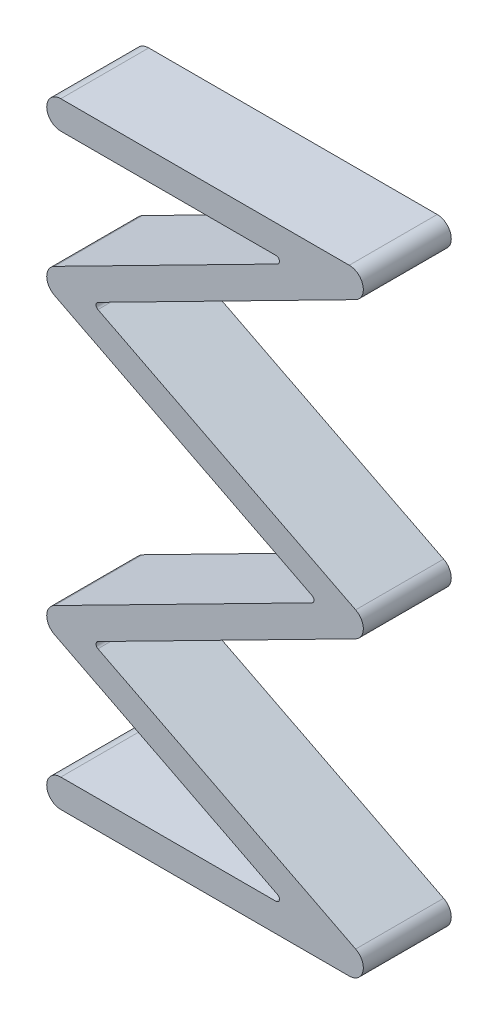
ISO-10303-21;
HEADER;
FILE_DESCRIPTION(('STEP AP214'),'2;1');
FILE_NAME('part.step','',(''),(''),'','','');
FILE_SCHEMA(('AUTOMOTIVE_DESIGN { 1 0 10303 214 1 1 1 1 }'));
ENDSEC;
DATA;
#1=APPLICATION_CONTEXT('core data for automotive mechanical design processes');
#2=APPLICATION_PROTOCOL_DEFINITION('international standard','automotive_design',2000,#1);
#3=PRODUCT_CONTEXT('',#1,'mechanical');
#4=PRODUCT('Part','Part','',(#3));
#5=PRODUCT_RELATED_PRODUCT_CATEGORY('part','',(#4));
#6=PRODUCT_DEFINITION_FORMATION('','',#4);
#7=PRODUCT_DEFINITION_CONTEXT('part definition',#1,'design');
#8=PRODUCT_DEFINITION('design','',#6,#7);
#9=PRODUCT_DEFINITION_SHAPE('','',#8);
#10=(LENGTH_UNIT() NAMED_UNIT(*) SI_UNIT(.MILLI.,.METRE.));
#11=(NAMED_UNIT(*) PLANE_ANGLE_UNIT() SI_UNIT($,.RADIAN.));
#12=(NAMED_UNIT(*) SI_UNIT($,.STERADIAN.) SOLID_ANGLE_UNIT());
#13=UNCERTAINTY_MEASURE_WITH_UNIT(LENGTH_MEASURE(1.E-05),#10,'distance_accuracy_value','');
#14=(GEOMETRIC_REPRESENTATION_CONTEXT(3) GLOBAL_UNCERTAINTY_ASSIGNED_CONTEXT((#13)) GLOBAL_UNIT_ASSIGNED_CONTEXT((#10,
#11,#12)) REPRESENTATION_CONTEXT('',''));
#15=CARTESIAN_POINT('',(0.,0.,0.));
#16=DIRECTION('',(0.,0.,1.));
#17=DIRECTION('',(1.,0.,0.));
#18=AXIS2_PLACEMENT_3D('',#15,#16,#17);
#19=CARTESIAN_POINT('',(0.4,17.1,2.5));
#20=DIRECTION('',(0.,0.,-1.));
#21=DIRECTION('',(-1.,0.,0.));
#22=AXIS2_PLACEMENT_3D('',#19,#20,#21);
#23=CYLINDRICAL_SURFACE('',#22,0.400000000000001);
#24=CARTESIAN_POINT('',(0.4,17.1,0.));
#25=DIRECTION('',(0.,0.,1.));
#26=DIRECTION('',(-1.,0.,0.));
#27=AXIS2_PLACEMENT_3D('',#24,#25,#26);
#28=CIRCLE('',#27,0.400000000000001);
#29=CARTESIAN_POINT('',(0.4,17.5,0.));
#30=VERTEX_POINT('',#29);
#31=CARTESIAN_POINT('',(0.4,16.7,0.));
#32=VERTEX_POINT('',#31);
#33=EDGE_CURVE('E212',#30,#32,#28,.T.);
#34=ORIENTED_EDGE('',*,*,#33,.T.);
#35=DIRECTION('',(0.,0.,-1.));
#36=VECTOR('',#35,1.);
#37=CARTESIAN_POINT('',(0.4,16.7,2.5));
#38=LINE('',#37,#36);
#39=CARTESIAN_POINT('',(0.4,16.7,2.5));
#40=VERTEX_POINT('',#39);
#41=EDGE_CURVE('E194',#40,#32,#38,.T.);
#42=ORIENTED_EDGE('',*,*,#41,.F.);
#43=CARTESIAN_POINT('',(0.4,17.1,2.5));
#44=DIRECTION('',(0.,0.,1.));
#45=DIRECTION('',(-1.,0.,0.));
#46=AXIS2_PLACEMENT_3D('',#43,#44,#45);
#47=CIRCLE('',#46,0.400000000000001);
#48=CARTESIAN_POINT('',(0.4,17.5,2.5));
#49=VERTEX_POINT('',#48);
#50=EDGE_CURVE('E199',#49,#40,#47,.T.);
#51=ORIENTED_EDGE('',*,*,#50,.F.);
#52=DIRECTION('',(0.,0.,-1.));
#53=VECTOR('',#52,1.);
#54=CARTESIAN_POINT('',(0.4,17.5,2.5));
#55=LINE('',#54,#53);
#56=EDGE_CURVE('E366',#49,#30,#55,.T.);
#57=ORIENTED_EDGE('',*,*,#56,.T.);
#58=EDGE_LOOP('',(#34,#42,#51,#57));
#59=FACE_BOUND('',#58,.T.);
#60=ADVANCED_FACE('F33',(#59),#23,.T.);
#61=CARTESIAN_POINT('',(0.4,16.7,2.5));
#62=DIRECTION('',(0.,1.,0.));
#63=DIRECTION('',(0.,0.,1.));
#64=AXIS2_PLACEMENT_3D('',#61,#62,#63);
#65=PLANE('',#64);
#66=DIRECTION('',(1.,0.,0.));
#67=VECTOR('',#66,1.);
#68=CARTESIAN_POINT('',(0.4,16.7,0.));
#69=LINE('',#68,#67);
#70=CARTESIAN_POINT('',(6.51596835309641,16.7,0.));
#71=VERTEX_POINT('',#70);
#72=EDGE_CURVE('E342',#32,#71,#69,.T.);
#73=ORIENTED_EDGE('',*,*,#72,.T.);
#74=DIRECTION('',(0.,0.,-1.));
#75=VECTOR('',#74,1.);
#76=CARTESIAN_POINT('',(6.51596835309641,16.7,2.5));
#77=LINE('',#76,#75);
#78=CARTESIAN_POINT('',(6.51596835309641,16.7,2.5));
#79=VERTEX_POINT('',#78);
#80=EDGE_CURVE('E48',#71,#79,#77,.F.);
#81=ORIENTED_EDGE('',*,*,#80,.T.);
#82=DIRECTION('',(1.,0.,0.));
#83=VECTOR('',#82,1.);
#84=CARTESIAN_POINT('',(0.4,16.7,2.5));
#85=LINE('',#84,#83);
#86=EDGE_CURVE('E190',#40,#79,#85,.T.);
#87=ORIENTED_EDGE('',*,*,#86,.F.);
#88=ORIENTED_EDGE('',*,*,#41,.T.);
#89=EDGE_LOOP('',(#73,#81,#87,#88));
#90=FACE_BOUND('',#89,.T.);
#91=ADVANCED_FACE('F192',(#90),#65,.F.);
#92=CARTESIAN_POINT('',(6.93277468247713,16.7,2.5));
#93=DIRECTION('',(0.453722270865693,-0.891143142778128,0.));
#94=DIRECTION('',(0.891143142778128,0.453722270865693,0.));
#95=AXIS2_PLACEMENT_3D('',#92,#93,#94);
#96=PLANE('',#95);
#97=DIRECTION('',(-0.891143142778128,-0.453722270865693,0.));
#98=VECTOR('',#97,1.);
#99=CARTESIAN_POINT('',(6.93277468247713,16.7,2.5));
#100=LINE('',#99,#98);
#101=CARTESIAN_POINT('',(6.56134058018298,16.5108856857222,2.5));
#102=VERTEX_POINT('',#101);
#103=CARTESIAN_POINT('',(0.218511091653721,13.2814572571113,2.5));
#104=VERTEX_POINT('',#103);
#105=EDGE_CURVE('E198',#102,#104,#100,.T.);
#106=ORIENTED_EDGE('',*,*,#105,.F.);
#107=DIRECTION('',(0.,0.,-1.));
#108=VECTOR('',#107,1.);
#109=CARTESIAN_POINT('',(6.56134058018298,16.5108856857222,0.));
#110=LINE('',#109,#108);
#111=CARTESIAN_POINT('',(6.56134058018298,16.5108856857222,0.));
#112=VERTEX_POINT('',#111);
#113=EDGE_CURVE('E293',#102,#112,#110,.T.);
#114=ORIENTED_EDGE('',*,*,#113,.T.);
#115=DIRECTION('',(-0.891143142778128,-0.453722270865693,0.));
#116=VECTOR('',#115,1.);
#117=CARTESIAN_POINT('',(6.93277468247713,16.7,0.));
#118=LINE('',#117,#116);
#119=CARTESIAN_POINT('',(0.218511091653721,13.2814572571113,0.));
#120=VERTEX_POINT('',#119);
#121=EDGE_CURVE('E338',#112,#120,#118,.T.);
#122=ORIENTED_EDGE('',*,*,#121,.T.);
#123=DIRECTION('',(0.,0.,-1.));
#124=VECTOR('',#123,1.);
#125=CARTESIAN_POINT('',(0.21851109165372,13.2814572571113,2.5));
#126=LINE('',#125,#124);
#127=EDGE_CURVE('E264',#120,#104,#126,.F.);
#128=ORIENTED_EDGE('',*,*,#127,.T.);
#129=EDGE_LOOP('',(#106,#114,#122,#128));
#130=FACE_BOUND('',#129,.T.);
#131=ADVANCED_FACE('F407',(#130),#96,.F.);
#132=CARTESIAN_POINT('',(-0.481596575007899,12.925,2.5));
#133=DIRECTION('',(0.453722270865693,0.891143142778128,0.));
#134=DIRECTION('',(-0.891143142778128,0.453722270865693,0.));
#135=AXIS2_PLACEMENT_3D('',#132,#133,#134);
#136=PLANE('',#135);
#137=DIRECTION('',(0.891143142778128,-0.453722270865693,0.));
#138=VECTOR('',#137,1.);
#139=CARTESIAN_POINT('',(-0.481596575007899,12.925,0.));
#140=LINE('',#139,#138);
#141=CARTESIAN_POINT('',(0.218511091653719,12.5685427428888,0.));
#142=VERTEX_POINT('',#141);
#143=CARTESIAN_POINT('',(7.5433765083267,8.83911431427781,0.));
#144=VERTEX_POINT('',#143);
#145=EDGE_CURVE('E333',#142,#144,#140,.T.);
#146=ORIENTED_EDGE('',*,*,#145,.T.);
#147=DIRECTION('',(0.,0.,-1.));
#148=VECTOR('',#147,1.);
#149=CARTESIAN_POINT('',(7.5433765083267,8.83911431427781,2.5));
#150=LINE('',#149,#148);
#151=CARTESIAN_POINT('',(7.5433765083267,8.83911431427781,2.5));
#152=VERTEX_POINT('',#151);
#153=EDGE_CURVE('E291',#144,#152,#150,.F.);
#154=ORIENTED_EDGE('',*,*,#153,.T.);
#155=DIRECTION('',(0.891143142778128,-0.453722270865693,0.));
#156=VECTOR('',#155,1.);
#157=CARTESIAN_POINT('',(-0.481596575007899,12.925,2.5));
#158=LINE('',#157,#156);
#159=CARTESIAN_POINT('',(0.218511091653719,12.5685427428888,2.5));
#160=VERTEX_POINT('',#159);
#161=EDGE_CURVE('E317',#160,#152,#158,.T.);
#162=ORIENTED_EDGE('',*,*,#161,.F.);
#163=DIRECTION('',(0.,0.,-1.));
#164=VECTOR('',#163,1.);
#165=CARTESIAN_POINT('',(0.218511091653719,12.5685427428888,2.5));
#166=LINE('',#165,#164);
#167=EDGE_CURVE('E261',#160,#142,#166,.T.);
#168=ORIENTED_EDGE('',*,*,#167,.T.);
#169=EDGE_LOOP('',(#146,#154,#162,#168));
#170=FACE_BOUND('',#169,.T.);
#171=ADVANCED_FACE('F336',(#170),#136,.F.);
#172=CARTESIAN_POINT('',(7.7184034249921,8.75,2.5));
#173=DIRECTION('',(0.453722270865693,-0.891143142778128,0.));
#174=DIRECTION('',(0.891143142778128,0.453722270865693,0.));
#175=AXIS2_PLACEMENT_3D('',#172,#173,#174);
#176=PLANE('',#175);
#177=DIRECTION('',(-0.891143142778128,-0.453722270865693,0.));
#178=VECTOR('',#177,1.);
#179=CARTESIAN_POINT('',(7.7184034249921,8.75,2.5));
#180=LINE('',#179,#178);
#181=CARTESIAN_POINT('',(7.5433765083267,8.66088568572219,2.5));
#182=VERTEX_POINT('',#181);
#183=CARTESIAN_POINT('',(0.218511091653725,4.93145725711125,2.5));
#184=VERTEX_POINT('',#183);
#185=EDGE_CURVE('E315',#182,#184,#180,.T.);
#186=ORIENTED_EDGE('',*,*,#185,.F.);
#187=DIRECTION('',(0.,0.,-1.));
#188=VECTOR('',#187,1.);
#189=CARTESIAN_POINT('',(7.5433765083267,8.66088568572219,0.));
#190=LINE('',#189,#188);
#191=CARTESIAN_POINT('',(7.5433765083267,8.66088568572219,0.));
#192=VERTEX_POINT('',#191);
#193=EDGE_CURVE('E288',#182,#192,#190,.T.);
#194=ORIENTED_EDGE('',*,*,#193,.T.);
#195=DIRECTION('',(-0.891143142778128,-0.453722270865693,0.));
#196=VECTOR('',#195,1.);
#197=CARTESIAN_POINT('',(7.7184034249921,8.75,0.));
#198=LINE('',#197,#196);
#199=CARTESIAN_POINT('',(0.218511091653725,4.93145725711125,0.));
#200=VERTEX_POINT('',#199);
#201=EDGE_CURVE('E334',#192,#200,#198,.T.);
#202=ORIENTED_EDGE('',*,*,#201,.T.);
#203=DIRECTION('',(0.,0.,-1.));
#204=VECTOR('',#203,1.);
#205=CARTESIAN_POINT('',(0.218511091653725,4.93145725711125,2.5));
#206=LINE('',#205,#204);
#207=EDGE_CURVE('E270',#200,#184,#206,.F.);
#208=ORIENTED_EDGE('',*,*,#207,.T.);
#209=EDGE_LOOP('',(#186,#194,#202,#208));
#210=FACE_BOUND('',#209,.T.);
#211=ADVANCED_FACE('F322',(#210),#176,.F.);
#212=CARTESIAN_POINT('',(-0.481596575007893,4.575,2.5));
#213=DIRECTION('',(0.453722270865693,0.891143142778128,0.));
#214=DIRECTION('',(-0.891143142778128,0.453722270865693,0.));
#215=AXIS2_PLACEMENT_3D('',#212,#213,#214);
#216=PLANE('',#215);
#217=DIRECTION('',(0.891143142778128,-0.453722270865693,0.));
#218=VECTOR('',#217,1.);
#219=CARTESIAN_POINT('',(-0.481596575007893,4.575,0.));
#220=LINE('',#219,#218);
#221=CARTESIAN_POINT('',(0.218511091653725,4.21854274288875,0.));
#222=VERTEX_POINT('',#221);
#223=CARTESIAN_POINT('',(6.56134058018299,0.989114314277812,0.));
#224=VERTEX_POINT('',#223);
#225=EDGE_CURVE('E340',#222,#224,#220,.T.);
#226=ORIENTED_EDGE('',*,*,#225,.T.);
#227=DIRECTION('',(0.,0.,-1.));
#228=VECTOR('',#227,1.);
#229=CARTESIAN_POINT('',(6.56134058018299,0.989114314277812,2.5));
#230=LINE('',#229,#228);
#231=CARTESIAN_POINT('',(6.56134058018299,0.989114314277812,2.5));
#232=VERTEX_POINT('',#231);
#233=EDGE_CURVE('E276',#224,#232,#230,.F.);
#234=ORIENTED_EDGE('',*,*,#233,.T.);
#235=DIRECTION('',(0.891143142778128,-0.453722270865693,0.));
#236=VECTOR('',#235,1.);
#237=CARTESIAN_POINT('',(-0.481596575007893,4.575,2.5));
#238=LINE('',#237,#236);
#239=CARTESIAN_POINT('',(0.218511091653725,4.21854274288875,2.5));
#240=VERTEX_POINT('',#239);
#241=EDGE_CURVE('E326',#240,#232,#238,.T.);
#242=ORIENTED_EDGE('',*,*,#241,.F.);
#243=DIRECTION('',(0.,0.,-1.));
#244=VECTOR('',#243,1.);
#245=CARTESIAN_POINT('',(0.218511091653725,4.21854274288875,2.5));
#246=LINE('',#245,#244);
#247=EDGE_CURVE('E267',#240,#222,#246,.T.);
#248=ORIENTED_EDGE('',*,*,#247,.T.);
#249=EDGE_LOOP('',(#226,#234,#242,#248));
#250=FACE_BOUND('',#249,.T.);
#251=ADVANCED_FACE('F426',(#250),#216,.F.);
#252=CARTESIAN_POINT('',(0.4,0.8,2.5));
#253=DIRECTION('',(0.,-1.,0.));
#254=DIRECTION('',(1.,0.,0.));
#255=AXIS2_PLACEMENT_3D('',#252,#253,#254);
#256=PLANE('',#255);
#257=DIRECTION('',(-1.,0.,0.));
#258=VECTOR('',#257,1.);
#259=CARTESIAN_POINT('',(0.4,0.8,2.5));
#260=LINE('',#259,#258);
#261=CARTESIAN_POINT('',(6.51596835309642,0.8,2.5));
#262=VERTEX_POINT('',#261);
#263=CARTESIAN_POINT('',(0.4,0.8,2.5));
#264=VERTEX_POINT('',#263);
#265=EDGE_CURVE('E415',#262,#264,#260,.T.);
#266=ORIENTED_EDGE('',*,*,#265,.F.);
#267=DIRECTION('',(0.,0.,-1.));
#268=VECTOR('',#267,1.);
#269=CARTESIAN_POINT('',(6.51596835309642,0.8,0.));
#270=LINE('',#269,#268);
#271=CARTESIAN_POINT('',(6.51596835309642,0.8,0.));
#272=VERTEX_POINT('',#271);
#273=EDGE_CURVE('E273',#262,#272,#270,.T.);
#274=ORIENTED_EDGE('',*,*,#273,.T.);
#275=DIRECTION('',(-1.,0.,0.));
#276=VECTOR('',#275,1.);
#277=CARTESIAN_POINT('',(0.4,0.8,0.));
#278=LINE('',#277,#276);
#279=CARTESIAN_POINT('',(0.4,0.8,0.));
#280=VERTEX_POINT('',#279);
#281=EDGE_CURVE('E348',#272,#280,#278,.T.);
#282=ORIENTED_EDGE('',*,*,#281,.T.);
#283=DIRECTION('',(0.,0.,-1.));
#284=VECTOR('',#283,1.);
#285=CARTESIAN_POINT('',(0.4,0.8,2.5));
#286=LINE('',#285,#284);
#287=EDGE_CURVE('E214',#264,#280,#286,.T.);
#288=ORIENTED_EDGE('',*,*,#287,.F.);
#289=EDGE_LOOP('',(#266,#274,#282,#288));
#290=FACE_BOUND('',#289,.T.);
#291=ADVANCED_FACE('F420',(#290),#256,.F.);
#292=CARTESIAN_POINT('',(0.4,0.4,2.5));
#293=DIRECTION('',(0.,0.,-1.));
#294=DIRECTION('',(-1.,0.,0.));
#295=AXIS2_PLACEMENT_3D('',#292,#293,#294);
#296=CYLINDRICAL_SURFACE('',#295,0.4);
#297=CARTESIAN_POINT('',(0.4,0.4,0.));
#298=DIRECTION('',(0.,0.,1.));
#299=DIRECTION('',(1.,0.,0.));
#300=AXIS2_PLACEMENT_3D('',#297,#298,#299);
#301=CIRCLE('',#300,0.4);
#302=CARTESIAN_POINT('',(0.4,0.,0.));
#303=VERTEX_POINT('',#302);
#304=EDGE_CURVE('E350',#280,#303,#301,.T.);
#305=ORIENTED_EDGE('',*,*,#304,.T.);
#306=DIRECTION('',(0.,0.,-1.));
#307=VECTOR('',#306,1.);
#308=CARTESIAN_POINT('',(0.4,0.,2.5));
#309=LINE('',#308,#307);
#310=CARTESIAN_POINT('',(0.4,0.,2.5));
#311=VERTEX_POINT('',#310);
#312=EDGE_CURVE('E220',#311,#303,#309,.T.);
#313=ORIENTED_EDGE('',*,*,#312,.F.);
#314=CARTESIAN_POINT('',(0.4,0.4,2.5));
#315=DIRECTION('',(0.,0.,1.));
#316=DIRECTION('',(1.,0.,0.));
#317=AXIS2_PLACEMENT_3D('',#314,#315,#316);
#318=CIRCLE('',#317,0.4);
#319=EDGE_CURVE('E394',#264,#311,#318,.T.);
#320=ORIENTED_EDGE('',*,*,#319,.F.);
#321=ORIENTED_EDGE('',*,*,#287,.T.);
#322=EDGE_LOOP('',(#305,#313,#320,#321));
#323=FACE_BOUND('',#322,.T.);
#324=ADVANCED_FACE('F418',(#323),#296,.T.);
#325=CARTESIAN_POINT('',(0.4,0.,2.5));
#326=DIRECTION('',(0.,1.,0.));
#327=DIRECTION('',(-1.,0.,0.));
#328=AXIS2_PLACEMENT_3D('',#325,#326,#327);
#329=PLANE('',#328);
#330=DIRECTION('',(1.,0.,0.));
#331=VECTOR('',#330,1.);
#332=CARTESIAN_POINT('',(0.4,0.,0.));
#333=LINE('',#332,#331);
#334=CARTESIAN_POINT('',(8.6,0.,0.));
#335=VERTEX_POINT('',#334);
#336=EDGE_CURVE('E352',#303,#335,#333,.T.);
#337=ORIENTED_EDGE('',*,*,#336,.T.);
#338=DIRECTION('',(0.,0.,-1.));
#339=VECTOR('',#338,1.);
#340=CARTESIAN_POINT('',(8.6,0.,2.5));
#341=LINE('',#340,#339);
#342=CARTESIAN_POINT('',(8.6,0.,2.5));
#343=VERTEX_POINT('',#342);
#344=EDGE_CURVE('E237',#335,#343,#341,.F.);
#345=ORIENTED_EDGE('',*,*,#344,.T.);
#346=DIRECTION('',(1.,0.,0.));
#347=VECTOR('',#346,1.);
#348=CARTESIAN_POINT('',(0.4,0.,2.5));
#349=LINE('',#348,#347);
#350=EDGE_CURVE('E374',#311,#343,#349,.T.);
#351=ORIENTED_EDGE('',*,*,#350,.F.);
#352=ORIENTED_EDGE('',*,*,#312,.T.);
#353=EDGE_LOOP('',(#337,#345,#351,#352));
#354=FACE_BOUND('',#353,.T.);
#355=ADVANCED_FACE('F372',(#354),#329,.F.);
#356=CARTESIAN_POINT('',(1.2815965750079,4.575,2.5));
#357=DIRECTION('',(-0.453722270865693,-0.891143142778128,0.));
#358=DIRECTION('',(0.891143142778128,-0.453722270865693,0.));
#359=AXIS2_PLACEMENT_3D('',#356,#357,#358);
#360=PLANE('',#359);
#361=DIRECTION('',(-0.891143142778128,0.453722270865693,0.));
#362=VECTOR('',#361,1.);
#363=CARTESIAN_POINT('',(1.2815965750079,4.575,0.));
#364=LINE('',#363,#362);
#365=CARTESIAN_POINT('',(8.78148890834628,0.756457257111251,0.));
#366=VERTEX_POINT('',#365);
#367=CARTESIAN_POINT('',(1.45662349167331,4.48588568572219,0.));
#368=VERTEX_POINT('',#367);
#369=EDGE_CURVE('E355',#366,#368,#364,.T.);
#370=ORIENTED_EDGE('',*,*,#369,.T.);
#371=DIRECTION('',(0.,0.,-1.));
#372=VECTOR('',#371,1.);
#373=CARTESIAN_POINT('',(1.45662349167331,4.48588568572219,2.5));
#374=LINE('',#373,#372);
#375=CARTESIAN_POINT('',(1.45662349167331,4.48588568572219,2.5));
#376=VERTEX_POINT('',#375);
#377=EDGE_CURVE('E281',#368,#376,#374,.F.);
#378=ORIENTED_EDGE('',*,*,#377,.T.);
#379=DIRECTION('',(-0.891143142778128,0.453722270865693,0.));
#380=VECTOR('',#379,1.);
#381=CARTESIAN_POINT('',(1.2815965750079,4.575,2.5));
#382=LINE('',#381,#380);
#383=CARTESIAN_POINT('',(8.78148890834628,0.756457257111251,2.5));
#384=VERTEX_POINT('',#383);
#385=EDGE_CURVE('E388',#384,#376,#382,.T.);
#386=ORIENTED_EDGE('',*,*,#385,.F.);
#387=DIRECTION('',(0.,0.,-1.));
#388=VECTOR('',#387,1.);
#389=CARTESIAN_POINT('',(8.78148890834628,0.756457257111251,2.5));
#390=LINE('',#389,#388);
#391=EDGE_CURVE('E213',#384,#366,#390,.T.);
#392=ORIENTED_EDGE('',*,*,#391,.T.);
#393=EDGE_LOOP('',(#370,#378,#386,#392));
#394=FACE_BOUND('',#393,.T.);
#395=ADVANCED_FACE('F385',(#394),#360,.F.);
#396=CARTESIAN_POINT('',(9.4815965750079,8.75,2.5));
#397=DIRECTION('',(-0.453722270865693,0.891143142778128,0.));
#398=DIRECTION('',(-0.891143142778128,-0.453722270865693,0.));
#399=AXIS2_PLACEMENT_3D('',#396,#397,#398);
#400=PLANE('',#399);
#401=DIRECTION('',(0.891143142778128,0.453722270865693,0.));
#402=VECTOR('',#401,1.);
#403=CARTESIAN_POINT('',(9.4815965750079,8.75,2.5));
#404=LINE('',#403,#402);
#405=CARTESIAN_POINT('',(1.45662349167331,4.66411431427781,2.5));
#406=VERTEX_POINT('',#405);
#407=CARTESIAN_POINT('',(8.78148890834628,8.39354274288875,2.5));
#408=VERTEX_POINT('',#407);
#409=EDGE_CURVE('E390',#406,#408,#404,.T.);
#410=ORIENTED_EDGE('',*,*,#409,.F.);
#411=DIRECTION('',(0.,0.,-1.));
#412=VECTOR('',#411,1.);
#413=CARTESIAN_POINT('',(1.45662349167331,4.66411431427781,0.));
#414=LINE('',#413,#412);
#415=CARTESIAN_POINT('',(1.45662349167331,4.66411431427781,0.));
#416=VERTEX_POINT('',#415);
#417=EDGE_CURVE('E278',#406,#416,#414,.T.);
#418=ORIENTED_EDGE('',*,*,#417,.T.);
#419=DIRECTION('',(0.891143142778128,0.453722270865693,0.));
#420=VECTOR('',#419,1.);
#421=CARTESIAN_POINT('',(9.4815965750079,8.75,0.));
#422=LINE('',#421,#420);
#423=CARTESIAN_POINT('',(8.78148890834628,8.39354274288875,0.));
#424=VERTEX_POINT('',#423);
#425=EDGE_CURVE('E358',#416,#424,#422,.T.);
#426=ORIENTED_EDGE('',*,*,#425,.T.);
#427=DIRECTION('',(0.,0.,-1.));
#428=VECTOR('',#427,1.);
#429=CARTESIAN_POINT('',(8.78148890834628,8.39354274288875,2.5));
#430=LINE('',#429,#428);
#431=EDGE_CURVE('E252',#424,#408,#430,.F.);
#432=ORIENTED_EDGE('',*,*,#431,.T.);
#433=EDGE_LOOP('',(#410,#418,#426,#432));
#434=FACE_BOUND('',#433,.T.);
#435=ADVANCED_FACE('F488',(#434),#400,.F.);
#436=CARTESIAN_POINT('',(1.28159657500789,12.925,2.5));
#437=DIRECTION('',(-0.453722270865693,-0.891143142778128,0.));
#438=DIRECTION('',(0.891143142778128,-0.453722270865693,0.));
#439=AXIS2_PLACEMENT_3D('',#436,#437,#438);
#440=PLANE('',#439);
#441=DIRECTION('',(-0.891143142778128,0.453722270865693,0.));
#442=VECTOR('',#441,1.);
#443=CARTESIAN_POINT('',(1.28159657500789,12.925,0.));
#444=LINE('',#443,#442);
#445=CARTESIAN_POINT('',(8.78148890834628,9.10645725711125,0.));
#446=VERTEX_POINT('',#445);
#447=CARTESIAN_POINT('',(1.4566234916733,12.8358856857222,0.));
#448=VERTEX_POINT('',#447);
#449=EDGE_CURVE('E360',#446,#448,#444,.T.);
#450=ORIENTED_EDGE('',*,*,#449,.T.);
#451=DIRECTION('',(0.,0.,-1.));
#452=VECTOR('',#451,1.);
#453=CARTESIAN_POINT('',(1.4566234916733,12.8358856857222,2.5));
#454=LINE('',#453,#452);
#455=CARTESIAN_POINT('',(1.4566234916733,12.8358856857222,2.5));
#456=VERTEX_POINT('',#455);
#457=EDGE_CURVE('E286',#448,#456,#454,.F.);
#458=ORIENTED_EDGE('',*,*,#457,.T.);
#459=DIRECTION('',(-0.891143142778128,0.453722270865693,0.));
#460=VECTOR('',#459,1.);
#461=CARTESIAN_POINT('',(1.28159657500789,12.925,2.5));
#462=LINE('',#461,#460);
#463=CARTESIAN_POINT('',(8.78148890834628,9.10645725711125,2.5));
#464=VERTEX_POINT('',#463);
#465=EDGE_CURVE('E392',#464,#456,#462,.T.);
#466=ORIENTED_EDGE('',*,*,#465,.F.);
#467=DIRECTION('',(0.,0.,-1.));
#468=VECTOR('',#467,1.);
#469=CARTESIAN_POINT('',(8.78148890834628,9.10645725711125,2.5));
#470=LINE('',#469,#468);
#471=EDGE_CURVE('E249',#464,#446,#470,.T.);
#472=ORIENTED_EDGE('',*,*,#471,.T.);
#473=EDGE_LOOP('',(#450,#458,#466,#472));
#474=FACE_BOUND('',#473,.T.);
#475=ADVANCED_FACE('F481',(#474),#440,.F.);
#476=CARTESIAN_POINT('',(10.2672253175229,17.5,2.5));
#477=DIRECTION('',(-0.453722270865693,0.891143142778128,0.));
#478=DIRECTION('',(-0.891143142778128,-0.453722270865693,0.));
#479=AXIS2_PLACEMENT_3D('',#476,#477,#478);
#480=PLANE('',#479);
#481=DIRECTION('',(0.891143142778128,0.453722270865693,0.));
#482=VECTOR('',#481,1.);
#483=CARTESIAN_POINT('',(10.2672253175229,17.5,2.5));
#484=LINE('',#483,#482);
#485=CARTESIAN_POINT('',(1.4566234916733,13.0141143142778,2.5));
#486=VERTEX_POINT('',#485);
#487=CARTESIAN_POINT('',(8.78148890834627,16.7435427428887,2.5));
#488=VERTEX_POINT('',#487);
#489=EDGE_CURVE('E400',#486,#488,#484,.T.);
#490=ORIENTED_EDGE('',*,*,#489,.F.);
#491=DIRECTION('',(0.,0.,-1.));
#492=VECTOR('',#491,1.);
#493=CARTESIAN_POINT('',(1.4566234916733,13.0141143142778,0.));
#494=LINE('',#493,#492);
#495=CARTESIAN_POINT('',(1.4566234916733,13.0141143142778,0.));
#496=VERTEX_POINT('',#495);
#497=EDGE_CURVE('E283',#486,#496,#494,.T.);
#498=ORIENTED_EDGE('',*,*,#497,.T.);
#499=DIRECTION('',(0.891143142778128,0.453722270865693,0.));
#500=VECTOR('',#499,1.);
#501=CARTESIAN_POINT('',(10.2672253175229,17.5,0.));
#502=LINE('',#501,#500);
#503=CARTESIAN_POINT('',(8.78148890834627,16.7435427428887,0.));
#504=VERTEX_POINT('',#503);
#505=EDGE_CURVE('E363',#496,#504,#502,.T.);
#506=ORIENTED_EDGE('',*,*,#505,.T.);
#507=DIRECTION('',(0.,0.,-1.));
#508=VECTOR('',#507,1.);
#509=CARTESIAN_POINT('',(8.78148890834627,16.7435427428887,2.5));
#510=LINE('',#509,#508);
#511=EDGE_CURVE('E258',#504,#488,#510,.F.);
#512=ORIENTED_EDGE('',*,*,#511,.T.);
#513=EDGE_LOOP('',(#490,#498,#506,#512));
#514=FACE_BOUND('',#513,.T.);
#515=ADVANCED_FACE('F473',(#514),#480,.F.);
#516=CARTESIAN_POINT('',(0.4,17.5,2.5));
#517=DIRECTION('',(0.,-1.,0.));
#518=DIRECTION('',(0.,0.,-1.));
#519=AXIS2_PLACEMENT_3D('',#516,#517,#518);
#520=PLANE('',#519);
#521=DIRECTION('',(-1.,0.,0.));
#522=VECTOR('',#521,1.);
#523=CARTESIAN_POINT('',(0.4,17.5,2.5));
#524=LINE('',#523,#522);
#525=CARTESIAN_POINT('',(8.59999999999999,17.5,2.5));
#526=VERTEX_POINT('',#525);
#527=EDGE_CURVE('E205',#526,#49,#524,.T.);
#528=ORIENTED_EDGE('',*,*,#527,.F.);
#529=DIRECTION('',(0.,0.,-1.));
#530=VECTOR('',#529,1.);
#531=CARTESIAN_POINT('',(8.59999999999999,17.5,2.5));
#532=LINE('',#531,#530);
#533=CARTESIAN_POINT('',(8.59999999999999,17.5,0.));
#534=VERTEX_POINT('',#533);
#535=EDGE_CURVE('E255',#526,#534,#532,.T.);
#536=ORIENTED_EDGE('',*,*,#535,.T.);
#537=DIRECTION('',(-1.,0.,0.));
#538=VECTOR('',#537,1.);
#539=CARTESIAN_POINT('',(0.4,17.5,0.));
#540=LINE('',#539,#538);
#541=EDGE_CURVE('E209',#534,#30,#540,.T.);
#542=ORIENTED_EDGE('',*,*,#541,.T.);
#543=ORIENTED_EDGE('',*,*,#56,.F.);
#544=EDGE_LOOP('',(#528,#536,#542,#543));
#545=FACE_BOUND('',#544,.T.);
#546=ADVANCED_FACE('F468',(#545),#520,.F.);
#547=CARTESIAN_POINT('',(0.4,17.1,2.5));
#548=DIRECTION('',(0.,0.,-1.));
#549=DIRECTION('',(-1.,0.,0.));
#550=AXIS2_PLACEMENT_3D('',#547,#548,#549);
#551=PLANE('',#550);
#552=ORIENTED_EDGE('',*,*,#350,.T.);
#553=CARTESIAN_POINT('',(8.6,0.4,2.5));
#554=DIRECTION('',(0.,0.,-1.));
#555=DIRECTION('',(-1.,0.,0.));
#556=AXIS2_PLACEMENT_3D('',#553,#554,#555);
#557=CIRCLE('',#556,0.4);
#558=EDGE_CURVE('E247',#343,#384,#557,.F.);
#559=ORIENTED_EDGE('',*,*,#558,.T.);
#560=ORIENTED_EDGE('',*,*,#385,.T.);
#561=CARTESIAN_POINT('',(1.50199571875988,4.575,2.5));
#562=DIRECTION('',(0.,0.,-1.));
#563=DIRECTION('',(-1.,0.,0.));
#564=AXIS2_PLACEMENT_3D('',#561,#562,#563);
#565=CIRCLE('',#564,0.1);
#566=EDGE_CURVE('E303',#376,#406,#565,.T.);
#567=ORIENTED_EDGE('',*,*,#566,.T.);
#568=ORIENTED_EDGE('',*,*,#409,.T.);
#569=CARTESIAN_POINT('',(8.6,8.75,2.5));
#570=DIRECTION('',(0.,0.,-1.));
#571=DIRECTION('',(-1.,0.,0.));
#572=AXIS2_PLACEMENT_3D('',#569,#570,#571);
#573=CIRCLE('',#572,0.4);
#574=EDGE_CURVE('E245',#408,#464,#573,.F.);
#575=ORIENTED_EDGE('',*,*,#574,.T.);
#576=ORIENTED_EDGE('',*,*,#465,.T.);
#577=CARTESIAN_POINT('',(1.50199571875987,12.925,2.5));
#578=DIRECTION('',(0.,0.,-1.));
#579=DIRECTION('',(-1.,0.,0.));
#580=AXIS2_PLACEMENT_3D('',#577,#578,#579);
#581=CIRCLE('',#580,0.1);
#582=EDGE_CURVE('E307',#456,#486,#581,.T.);
#583=ORIENTED_EDGE('',*,*,#582,.T.);
#584=ORIENTED_EDGE('',*,*,#489,.T.);
#585=CARTESIAN_POINT('',(8.59999999999999,17.1,2.5));
#586=DIRECTION('',(0.,0.,-1.));
#587=DIRECTION('',(-1.,0.,0.));
#588=AXIS2_PLACEMENT_3D('',#585,#586,#587);
#589=CIRCLE('',#588,0.4);
#590=EDGE_CURVE('E243',#488,#526,#589,.F.);
#591=ORIENTED_EDGE('',*,*,#590,.T.);
#592=ORIENTED_EDGE('',*,*,#527,.T.);
#593=ORIENTED_EDGE('',*,*,#50,.T.);
#594=ORIENTED_EDGE('',*,*,#86,.T.);
#595=CARTESIAN_POINT('',(6.51596835309641,16.6,2.5));
#596=DIRECTION('',(0.,0.,-1.));
#597=DIRECTION('',(-1.,0.,0.));
#598=AXIS2_PLACEMENT_3D('',#595,#596,#597);
#599=CIRCLE('',#598,0.1);
#600=EDGE_CURVE('E11',#79,#102,#599,.T.);
#601=ORIENTED_EDGE('',*,*,#600,.T.);
#602=ORIENTED_EDGE('',*,*,#105,.T.);
#603=CARTESIAN_POINT('',(0.399999999999997,12.925,2.5));
#604=DIRECTION('',(0.,0.,-1.));
#605=DIRECTION('',(-1.,0.,0.));
#606=AXIS2_PLACEMENT_3D('',#603,#604,#605);
#607=CIRCLE('',#606,0.4);
#608=EDGE_CURVE('E241',#104,#160,#607,.F.);
#609=ORIENTED_EDGE('',*,*,#608,.T.);
#610=ORIENTED_EDGE('',*,*,#161,.T.);
#611=CARTESIAN_POINT('',(7.49800428124013,8.75,2.5));
#612=DIRECTION('',(0.,0.,-1.));
#613=DIRECTION('',(-1.,0.,0.));
#614=AXIS2_PLACEMENT_3D('',#611,#612,#613);
#615=CIRCLE('',#614,0.1);
#616=EDGE_CURVE('E311',#152,#182,#615,.T.);
#617=ORIENTED_EDGE('',*,*,#616,.T.);
#618=ORIENTED_EDGE('',*,*,#185,.T.);
#619=CARTESIAN_POINT('',(0.400000000000003,4.575,2.5));
#620=DIRECTION('',(0.,0.,-1.));
#621=DIRECTION('',(-1.,0.,0.));
#622=AXIS2_PLACEMENT_3D('',#619,#620,#621);
#623=CIRCLE('',#622,0.4);
#624=EDGE_CURVE('E239',#184,#240,#623,.F.);
#625=ORIENTED_EDGE('',*,*,#624,.T.);
#626=ORIENTED_EDGE('',*,*,#241,.T.);
#627=CARTESIAN_POINT('',(6.51596835309642,0.9,2.5));
#628=DIRECTION('',(0.,0.,-1.));
#629=DIRECTION('',(-1.,0.,0.));
#630=AXIS2_PLACEMENT_3D('',#627,#628,#629);
#631=CIRCLE('',#630,0.1);
#632=EDGE_CURVE('E299',#232,#262,#631,.T.);
#633=ORIENTED_EDGE('',*,*,#632,.T.);
#634=ORIENTED_EDGE('',*,*,#265,.T.);
#635=ORIENTED_EDGE('',*,*,#319,.T.);
#636=EDGE_LOOP('',(#552,#559,#560,#567,#568,#575,#576,#583,#584,#591,#592,#593,#594,#601,#602,
#609,#610,#617,#618,#625,#626,#633,#634,#635));
#637=FACE_BOUND('',#636,.T.);
#638=ADVANCED_FACE('F203',(#637),#551,.F.);
#639=CARTESIAN_POINT('',(0.4,17.1,0.));
#640=DIRECTION('',(0.,0.,-1.));
#641=DIRECTION('',(-1.,0.,0.));
#642=AXIS2_PLACEMENT_3D('',#639,#640,#641);
#643=PLANE('',#642);
#644=ORIENTED_EDGE('',*,*,#369,.F.);
#645=CARTESIAN_POINT('',(8.6,0.4,0.));
#646=DIRECTION('',(0.,0.,-1.));
#647=DIRECTION('',(-1.,0.,0.));
#648=AXIS2_PLACEMENT_3D('',#645,#646,#647);
#649=CIRCLE('',#648,0.4);
#650=EDGE_CURVE('E235',#366,#335,#649,.T.);
#651=ORIENTED_EDGE('',*,*,#650,.T.);
#652=ORIENTED_EDGE('',*,*,#336,.F.);
#653=ORIENTED_EDGE('',*,*,#304,.F.);
#654=ORIENTED_EDGE('',*,*,#281,.F.);
#655=CARTESIAN_POINT('',(6.51596835309642,0.9,0.));
#656=DIRECTION('',(0.,0.,-1.));
#657=DIRECTION('',(-1.,0.,0.));
#658=AXIS2_PLACEMENT_3D('',#655,#656,#657);
#659=CIRCLE('',#658,0.1);
#660=EDGE_CURVE('E297',#272,#224,#659,.F.);
#661=ORIENTED_EDGE('',*,*,#660,.T.);
#662=ORIENTED_EDGE('',*,*,#225,.F.);
#663=CARTESIAN_POINT('',(0.400000000000003,4.575,0.));
#664=DIRECTION('',(0.,0.,-1.));
#665=DIRECTION('',(-1.,0.,0.));
#666=AXIS2_PLACEMENT_3D('',#663,#664,#665);
#667=CIRCLE('',#666,0.4);
#668=EDGE_CURVE('E217',#222,#200,#667,.T.);
#669=ORIENTED_EDGE('',*,*,#668,.T.);
#670=ORIENTED_EDGE('',*,*,#201,.F.);
#671=CARTESIAN_POINT('',(7.49800428124013,8.75,0.));
#672=DIRECTION('',(0.,0.,-1.));
#673=DIRECTION('',(-1.,0.,0.));
#674=AXIS2_PLACEMENT_3D('',#671,#672,#673);
#675=CIRCLE('',#674,0.1);
#676=EDGE_CURVE('E309',#192,#144,#675,.F.);
#677=ORIENTED_EDGE('',*,*,#676,.T.);
#678=ORIENTED_EDGE('',*,*,#145,.F.);
#679=CARTESIAN_POINT('',(0.399999999999997,12.925,0.));
#680=DIRECTION('',(0.,0.,-1.));
#681=DIRECTION('',(-1.,0.,0.));
#682=AXIS2_PLACEMENT_3D('',#679,#680,#681);
#683=CIRCLE('',#682,0.4);
#684=EDGE_CURVE('E226',#142,#120,#683,.T.);
#685=ORIENTED_EDGE('',*,*,#684,.T.);
#686=ORIENTED_EDGE('',*,*,#121,.F.);
#687=CARTESIAN_POINT('',(6.51596835309641,16.6,0.));
#688=DIRECTION('',(0.,0.,-1.));
#689=DIRECTION('',(-1.,0.,0.));
#690=AXIS2_PLACEMENT_3D('',#687,#688,#689);
#691=CIRCLE('',#690,0.1);
#692=EDGE_CURVE('E41',#112,#71,#691,.F.);
#693=ORIENTED_EDGE('',*,*,#692,.T.);
#694=ORIENTED_EDGE('',*,*,#72,.F.);
#695=ORIENTED_EDGE('',*,*,#33,.F.);
#696=ORIENTED_EDGE('',*,*,#541,.F.);
#697=CARTESIAN_POINT('',(8.59999999999999,17.1,0.));
#698=DIRECTION('',(0.,0.,-1.));
#699=DIRECTION('',(-1.,0.,0.));
#700=AXIS2_PLACEMENT_3D('',#697,#698,#699);
#701=CIRCLE('',#700,0.4);
#702=EDGE_CURVE('E229',#534,#504,#701,.T.);
#703=ORIENTED_EDGE('',*,*,#702,.T.);
#704=ORIENTED_EDGE('',*,*,#505,.F.);
#705=CARTESIAN_POINT('',(1.50199571875987,12.925,0.));
#706=DIRECTION('',(0.,0.,-1.));
#707=DIRECTION('',(-1.,0.,0.));
#708=AXIS2_PLACEMENT_3D('',#705,#706,#707);
#709=CIRCLE('',#708,0.1);
#710=EDGE_CURVE('E305',#496,#448,#709,.F.);
#711=ORIENTED_EDGE('',*,*,#710,.T.);
#712=ORIENTED_EDGE('',*,*,#449,.F.);
#713=CARTESIAN_POINT('',(8.6,8.75,0.));
#714=DIRECTION('',(0.,0.,-1.));
#715=DIRECTION('',(-1.,0.,0.));
#716=AXIS2_PLACEMENT_3D('',#713,#714,#715);
#717=CIRCLE('',#716,0.4);
#718=EDGE_CURVE('E232',#446,#424,#717,.T.);
#719=ORIENTED_EDGE('',*,*,#718,.T.);
#720=ORIENTED_EDGE('',*,*,#425,.F.);
#721=CARTESIAN_POINT('',(1.50199571875988,4.575,0.));
#722=DIRECTION('',(0.,0.,-1.));
#723=DIRECTION('',(-1.,0.,0.));
#724=AXIS2_PLACEMENT_3D('',#721,#722,#723);
#725=CIRCLE('',#724,0.1);
#726=EDGE_CURVE('E301',#416,#368,#725,.F.);
#727=ORIENTED_EDGE('',*,*,#726,.T.);
#728=EDGE_LOOP('',(#644,#651,#652,#653,#654,#661,#662,#669,#670,#677,#678,#685,#686,#693,#694,
#695,#696,#703,#704,#711,#712,#719,#720,#727));
#729=FACE_BOUND('',#728,.T.);
#730=ADVANCED_FACE('F332',(#729),#643,.T.);
#731=CARTESIAN_POINT('',(8.6,0.4,2.5));
#732=DIRECTION('',(0.,0.,-1.));
#733=DIRECTION('',(-1.,0.,0.));
#734=AXIS2_PLACEMENT_3D('',#731,#732,#733);
#735=CYLINDRICAL_SURFACE('',#734,0.4);
#736=ORIENTED_EDGE('',*,*,#558,.F.);
#737=ORIENTED_EDGE('',*,*,#344,.F.);
#738=ORIENTED_EDGE('',*,*,#650,.F.);
#739=ORIENTED_EDGE('',*,*,#391,.F.);
#740=EDGE_LOOP('',(#736,#737,#738,#739));
#741=FACE_BOUND('',#740,.T.);
#742=ADVANCED_FACE('F382',(#741),#735,.T.);
#743=CARTESIAN_POINT('',(8.6,8.75,2.5));
#744=DIRECTION('',(0.,0.,-1.));
#745=DIRECTION('',(-1.,0.,0.));
#746=AXIS2_PLACEMENT_3D('',#743,#744,#745);
#747=CYLINDRICAL_SURFACE('',#746,0.4);
#748=ORIENTED_EDGE('',*,*,#574,.F.);
#749=ORIENTED_EDGE('',*,*,#431,.F.);
#750=ORIENTED_EDGE('',*,*,#718,.F.);
#751=ORIENTED_EDGE('',*,*,#471,.F.);
#752=EDGE_LOOP('',(#748,#749,#750,#751));
#753=FACE_BOUND('',#752,.T.);
#754=ADVANCED_FACE('F455',(#753),#747,.T.);
#755=CARTESIAN_POINT('',(8.59999999999999,17.1,2.5));
#756=DIRECTION('',(0.,0.,-1.));
#757=DIRECTION('',(-1.,0.,0.));
#758=AXIS2_PLACEMENT_3D('',#755,#756,#757);
#759=CYLINDRICAL_SURFACE('',#758,0.4);
#760=ORIENTED_EDGE('',*,*,#590,.F.);
#761=ORIENTED_EDGE('',*,*,#511,.F.);
#762=ORIENTED_EDGE('',*,*,#702,.F.);
#763=ORIENTED_EDGE('',*,*,#535,.F.);
#764=EDGE_LOOP('',(#760,#761,#762,#763));
#765=FACE_BOUND('',#764,.T.);
#766=ADVANCED_FACE('F442',(#765),#759,.T.);
#767=CARTESIAN_POINT('',(0.399999999999997,12.925,2.5));
#768=DIRECTION('',(0.,0.,-1.));
#769=DIRECTION('',(-1.,0.,0.));
#770=AXIS2_PLACEMENT_3D('',#767,#768,#769);
#771=CYLINDRICAL_SURFACE('',#770,0.4);
#772=ORIENTED_EDGE('',*,*,#608,.F.);
#773=ORIENTED_EDGE('',*,*,#127,.F.);
#774=ORIENTED_EDGE('',*,*,#684,.F.);
#775=ORIENTED_EDGE('',*,*,#167,.F.);
#776=EDGE_LOOP('',(#772,#773,#774,#775));
#777=FACE_BOUND('',#776,.T.);
#778=ADVANCED_FACE('F434',(#777),#771,.T.);
#779=CARTESIAN_POINT('',(0.400000000000003,4.575,2.5));
#780=DIRECTION('',(0.,0.,-1.));
#781=DIRECTION('',(-1.,0.,0.));
#782=AXIS2_PLACEMENT_3D('',#779,#780,#781);
#783=CYLINDRICAL_SURFACE('',#782,0.4);
#784=ORIENTED_EDGE('',*,*,#624,.F.);
#785=ORIENTED_EDGE('',*,*,#207,.F.);
#786=ORIENTED_EDGE('',*,*,#668,.F.);
#787=ORIENTED_EDGE('',*,*,#247,.F.);
#788=EDGE_LOOP('',(#784,#785,#786,#787));
#789=FACE_BOUND('',#788,.T.);
#790=ADVANCED_FACE('F432',(#789),#783,.T.);
#791=CARTESIAN_POINT('',(6.51596835309642,0.9,2.5));
#792=DIRECTION('',(0.,0.,1.));
#793=DIRECTION('',(1.,0.,0.));
#794=AXIS2_PLACEMENT_3D('',#791,#792,#793);
#795=CYLINDRICAL_SURFACE('',#794,0.1);
#796=ORIENTED_EDGE('',*,*,#632,.F.);
#797=ORIENTED_EDGE('',*,*,#233,.F.);
#798=ORIENTED_EDGE('',*,*,#660,.F.);
#799=ORIENTED_EDGE('',*,*,#273,.F.);
#800=EDGE_LOOP('',(#796,#797,#798,#799));
#801=FACE_BOUND('',#800,.T.);
#802=ADVANCED_FACE('F430',(#801),#795,.F.);
#803=CARTESIAN_POINT('',(1.50199571875988,4.575,2.5));
#804=DIRECTION('',(0.,0.,1.));
#805=DIRECTION('',(1.,0.,0.));
#806=AXIS2_PLACEMENT_3D('',#803,#804,#805);
#807=CYLINDRICAL_SURFACE('',#806,0.1);
#808=ORIENTED_EDGE('',*,*,#566,.F.);
#809=ORIENTED_EDGE('',*,*,#377,.F.);
#810=ORIENTED_EDGE('',*,*,#726,.F.);
#811=ORIENTED_EDGE('',*,*,#417,.F.);
#812=EDGE_LOOP('',(#808,#809,#810,#811));
#813=FACE_BOUND('',#812,.T.);
#814=ADVANCED_FACE('F440',(#813),#807,.F.);
#815=CARTESIAN_POINT('',(1.50199571875987,12.925,2.5));
#816=DIRECTION('',(0.,0.,1.));
#817=DIRECTION('',(1.,0.,0.));
#818=AXIS2_PLACEMENT_3D('',#815,#816,#817);
#819=CYLINDRICAL_SURFACE('',#818,0.1);
#820=ORIENTED_EDGE('',*,*,#582,.F.);
#821=ORIENTED_EDGE('',*,*,#457,.F.);
#822=ORIENTED_EDGE('',*,*,#710,.F.);
#823=ORIENTED_EDGE('',*,*,#497,.F.);
#824=EDGE_LOOP('',(#820,#821,#822,#823));
#825=FACE_BOUND('',#824,.T.);
#826=ADVANCED_FACE('F477',(#825),#819,.F.);
#827=CARTESIAN_POINT('',(7.49800428124013,8.75,2.5));
#828=DIRECTION('',(0.,0.,1.));
#829=DIRECTION('',(1.,0.,0.));
#830=AXIS2_PLACEMENT_3D('',#827,#828,#829);
#831=CYLINDRICAL_SURFACE('',#830,0.1);
#832=ORIENTED_EDGE('',*,*,#616,.F.);
#833=ORIENTED_EDGE('',*,*,#153,.F.);
#834=ORIENTED_EDGE('',*,*,#676,.F.);
#835=ORIENTED_EDGE('',*,*,#193,.F.);
#836=EDGE_LOOP('',(#832,#833,#834,#835));
#837=FACE_BOUND('',#836,.T.);
#838=ADVANCED_FACE('F328',(#837),#831,.F.);
#839=CARTESIAN_POINT('',(6.51596835309641,16.6,2.5));
#840=DIRECTION('',(0.,0.,1.));
#841=DIRECTION('',(1.,0.,0.));
#842=AXIS2_PLACEMENT_3D('',#839,#840,#841);
#843=CYLINDRICAL_SURFACE('',#842,0.1);
#844=ORIENTED_EDGE('',*,*,#600,.F.);
#845=ORIENTED_EDGE('',*,*,#80,.F.);
#846=ORIENTED_EDGE('',*,*,#692,.F.);
#847=ORIENTED_EDGE('',*,*,#113,.F.);
#848=EDGE_LOOP('',(#844,#845,#846,#847));
#849=FACE_BOUND('',#848,.T.);
#850=ADVANCED_FACE('F35',(#849),#843,.F.);
#851=CLOSED_SHELL('',(#60,#91,#131,#171,#211,#251,#291,#324,#355,#395,#435,#475,#515,#546,#638,
#730,#742,#754,#766,#778,#790,#802,#814,#826,#838,#850));
#852=MANIFOLD_SOLID_BREP('B2',#851);
#853=ADVANCED_BREP_SHAPE_REPRESENTATION('',(#18,#852),#14);
#854=SHAPE_DEFINITION_REPRESENTATION(#9,#853);
ENDSEC;
END-ISO-10303-21;
